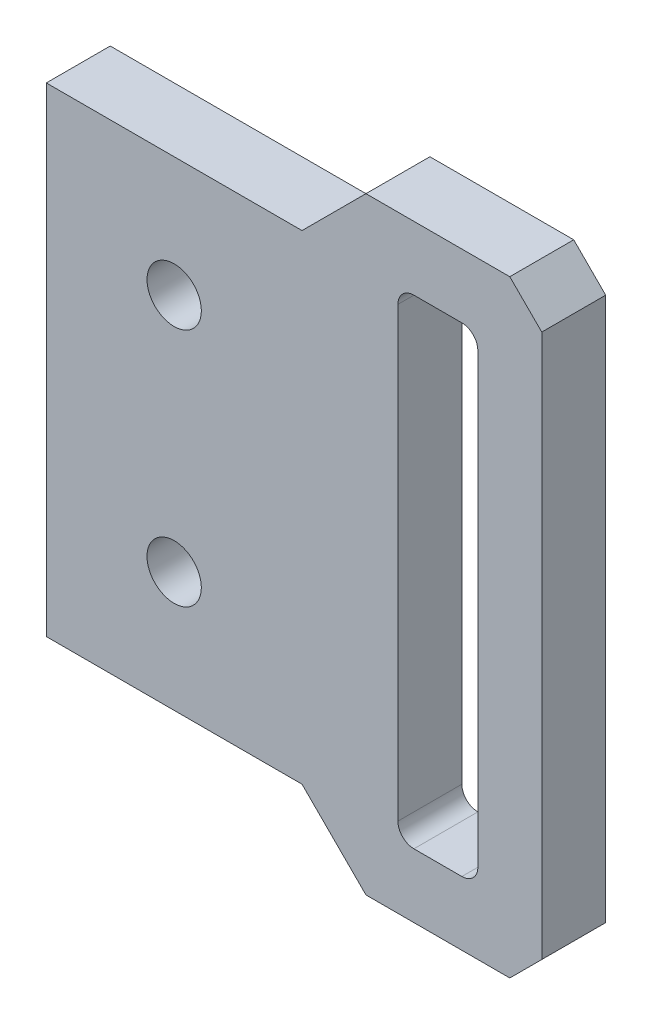
ISO-10303-21;
HEADER;
FILE_DESCRIPTION(('STEP AP214'),'2;1');
FILE_NAME('part.step','',(''),(''),'','','');
FILE_SCHEMA(('AUTOMOTIVE_DESIGN { 1 0 10303 214 1 1 1 1 }'));
ENDSEC;
DATA;
#1=APPLICATION_CONTEXT('core data for automotive mechanical design processes');
#2=APPLICATION_PROTOCOL_DEFINITION('international standard','automotive_design',2000,#1);
#3=PRODUCT_CONTEXT('',#1,'mechanical');
#4=PRODUCT('Part','Part','',(#3));
#5=PRODUCT_RELATED_PRODUCT_CATEGORY('part','',(#4));
#6=PRODUCT_DEFINITION_FORMATION('','',#4);
#7=PRODUCT_DEFINITION_CONTEXT('part definition',#1,'design');
#8=PRODUCT_DEFINITION('design','',#6,#7);
#9=PRODUCT_DEFINITION_SHAPE('','',#8);
#10=(LENGTH_UNIT() NAMED_UNIT(*) SI_UNIT(.MILLI.,.METRE.));
#11=(NAMED_UNIT(*) PLANE_ANGLE_UNIT() SI_UNIT($,.RADIAN.));
#12=(NAMED_UNIT(*) SI_UNIT($,.STERADIAN.) SOLID_ANGLE_UNIT());
#13=UNCERTAINTY_MEASURE_WITH_UNIT(LENGTH_MEASURE(1.E-05),#10,'distance_accuracy_value','');
#14=(GEOMETRIC_REPRESENTATION_CONTEXT(3) GLOBAL_UNCERTAINTY_ASSIGNED_CONTEXT((#13)) GLOBAL_UNIT_ASSIGNED_CONTEXT((#10,
#11,#12)) REPRESENTATION_CONTEXT('',''));
#15=CARTESIAN_POINT('',(0.,0.,0.));
#16=DIRECTION('',(0.,0.,1.));
#17=DIRECTION('',(1.,0.,0.));
#18=AXIS2_PLACEMENT_3D('',#15,#16,#17);
#19=CARTESIAN_POINT('',(0.,0.,4.));
#20=DIRECTION('',(0.,0.,1.));
#21=DIRECTION('',(1.,0.,0.));
#22=AXIS2_PLACEMENT_3D('',#19,#20,#21);
#23=PLANE('',#22);
#24=DIRECTION('',(-1.,0.,0.));
#25=VECTOR('',#24,1.);
#26=CARTESIAN_POINT('',(6.5,19.,4.));
#27=LINE('',#26,#25);
#28=CARTESIAN_POINT('',(4.5,19.,4.));
#29=VERTEX_POINT('',#28);
#30=CARTESIAN_POINT('',(-4.5,19.,4.));
#31=VERTEX_POINT('',#30);
#32=EDGE_CURVE('E168',#29,#31,#27,.T.);
#33=ORIENTED_EDGE('',*,*,#32,.T.);
#34=DIRECTION('',(0.707106781186549,0.707106781186546,0.));
#35=VECTOR('',#34,1.);
#36=CARTESIAN_POINT('',(-11.75,11.75,4.));
#37=LINE('',#36,#35);
#38=CARTESIAN_POINT('',(-8.5,15.,4.));
#39=VERTEX_POINT('',#38);
#40=EDGE_CURVE('E161',#31,#39,#37,.F.);
#41=ORIENTED_EDGE('',*,*,#40,.T.);
#42=DIRECTION('',(-1.,0.,0.));
#43=VECTOR('',#42,1.);
#44=CARTESIAN_POINT('',(-8.5,15.,4.));
#45=LINE('',#44,#43);
#46=CARTESIAN_POINT('',(-24.5,15.,4.));
#47=VERTEX_POINT('',#46);
#48=EDGE_CURVE('E165',#39,#47,#45,.T.);
#49=ORIENTED_EDGE('',*,*,#48,.T.);
#50=DIRECTION('',(0.,-1.,0.));
#51=VECTOR('',#50,1.);
#52=CARTESIAN_POINT('',(-24.5,15.,4.));
#53=LINE('',#52,#51);
#54=CARTESIAN_POINT('',(-24.5,-15.,4.));
#55=VERTEX_POINT('',#54);
#56=EDGE_CURVE('E185',#47,#55,#53,.T.);
#57=ORIENTED_EDGE('',*,*,#56,.T.);
#58=DIRECTION('',(1.,0.,0.));
#59=VECTOR('',#58,1.);
#60=CARTESIAN_POINT('',(-24.5,-15.,4.));
#61=LINE('',#60,#59);
#62=CARTESIAN_POINT('',(-8.5,-15.,4.));
#63=VERTEX_POINT('',#62);
#64=EDGE_CURVE('E188',#55,#63,#61,.T.);
#65=ORIENTED_EDGE('',*,*,#64,.T.);
#66=DIRECTION('',(-0.707106781186546,0.707106781186549,0.));
#67=VECTOR('',#66,1.);
#68=CARTESIAN_POINT('',(-11.75,-11.75,4.));
#69=LINE('',#68,#67);
#70=CARTESIAN_POINT('',(-4.5,-19.,4.));
#71=VERTEX_POINT('',#70);
#72=EDGE_CURVE('E269',#63,#71,#69,.F.);
#73=ORIENTED_EDGE('',*,*,#72,.T.);
#74=DIRECTION('',(1.,0.,0.));
#75=VECTOR('',#74,1.);
#76=CARTESIAN_POINT('',(6.5,-19.,4.));
#77=LINE('',#76,#75);
#78=CARTESIAN_POINT('',(4.5,-19.,4.));
#79=VERTEX_POINT('',#78);
#80=EDGE_CURVE('E240',#71,#79,#77,.T.);
#81=ORIENTED_EDGE('',*,*,#80,.T.);
#82=DIRECTION('',(-0.707106781186549,-0.707106781186546,0.));
#83=VECTOR('',#82,1.);
#84=CARTESIAN_POINT('',(11.75,-11.75,4.));
#85=LINE('',#84,#83);
#86=CARTESIAN_POINT('',(6.5,-17.,4.));
#87=VERTEX_POINT('',#86);
#88=EDGE_CURVE('E172',#79,#87,#85,.F.);
#89=ORIENTED_EDGE('',*,*,#88,.T.);
#90=DIRECTION('',(0.,1.,0.));
#91=VECTOR('',#90,1.);
#92=CARTESIAN_POINT('',(6.5,-19.,4.));
#93=LINE('',#92,#91);
#94=CARTESIAN_POINT('',(6.5,17.,4.));
#95=VERTEX_POINT('',#94);
#96=EDGE_CURVE('E243',#87,#95,#93,.T.);
#97=ORIENTED_EDGE('',*,*,#96,.T.);
#98=DIRECTION('',(0.707106781186546,-0.707106781186549,0.));
#99=VECTOR('',#98,1.);
#100=CARTESIAN_POINT('',(11.75,11.75,4.));
#101=LINE('',#100,#99);
#102=EDGE_CURVE('E267',#95,#29,#101,.F.);
#103=ORIENTED_EDGE('',*,*,#102,.T.);
#104=EDGE_LOOP('',(#33,#41,#49,#57,#65,#73,#81,#89,#97,#103));
#105=FACE_BOUND('',#104,.T.);
#106=DIRECTION('',(0.,1.,0.));
#107=VECTOR('',#106,1.);
#108=CARTESIAN_POINT('',(2.5,-15.,4.));
#109=LINE('',#108,#107);
#110=CARTESIAN_POINT('',(2.5,-14.,4.));
#111=VERTEX_POINT('',#110);
#112=CARTESIAN_POINT('',(2.5,14.,4.));
#113=VERTEX_POINT('',#112);
#114=EDGE_CURVE('E220',#111,#113,#109,.T.);
#115=ORIENTED_EDGE('',*,*,#114,.F.);
#116=CARTESIAN_POINT('',(1.5,-14.,4.));
#117=DIRECTION('',(0.,0.,1.));
#118=DIRECTION('',(1.,0.,0.));
#119=AXIS2_PLACEMENT_3D('',#116,#117,#118);
#120=CIRCLE('',#119,1.);
#121=CARTESIAN_POINT('',(1.5,-15.,4.));
#122=VERTEX_POINT('',#121);
#123=EDGE_CURVE('E302',#111,#122,#120,.F.);
#124=ORIENTED_EDGE('',*,*,#123,.T.);
#125=DIRECTION('',(1.,0.,0.));
#126=VECTOR('',#125,1.);
#127=CARTESIAN_POINT('',(2.5,-15.,4.));
#128=LINE('',#127,#126);
#129=CARTESIAN_POINT('',(-1.5,-15.,4.));
#130=VERTEX_POINT('',#129);
#131=EDGE_CURVE('E217',#130,#122,#128,.T.);
#132=ORIENTED_EDGE('',*,*,#131,.F.);
#133=CARTESIAN_POINT('',(-1.5,-14.,4.));
#134=DIRECTION('',(0.,0.,1.));
#135=DIRECTION('',(1.,0.,0.));
#136=AXIS2_PLACEMENT_3D('',#133,#134,#135);
#137=CIRCLE('',#136,1.);
#138=CARTESIAN_POINT('',(-2.5,-14.,4.));
#139=VERTEX_POINT('',#138);
#140=EDGE_CURVE('E306',#130,#139,#137,.F.);
#141=ORIENTED_EDGE('',*,*,#140,.T.);
#142=DIRECTION('',(0.,-1.,0.));
#143=VECTOR('',#142,1.);
#144=CARTESIAN_POINT('',(-2.5,-15.,4.));
#145=LINE('',#144,#143);
#146=CARTESIAN_POINT('',(-2.5,14.,4.));
#147=VERTEX_POINT('',#146);
#148=EDGE_CURVE('E226',#147,#139,#145,.T.);
#149=ORIENTED_EDGE('',*,*,#148,.F.);
#150=CARTESIAN_POINT('',(-1.5,14.,4.));
#151=DIRECTION('',(0.,0.,1.));
#152=DIRECTION('',(1.,0.,0.));
#153=AXIS2_PLACEMENT_3D('',#150,#151,#152);
#154=CIRCLE('',#153,1.);
#155=CARTESIAN_POINT('',(-1.5,15.,4.));
#156=VERTEX_POINT('',#155);
#157=EDGE_CURVE('E11',#147,#156,#154,.F.);
#158=ORIENTED_EDGE('',*,*,#157,.T.);
#159=DIRECTION('',(-1.,0.,0.));
#160=VECTOR('',#159,1.);
#161=CARTESIAN_POINT('',(2.5,15.,4.));
#162=LINE('',#161,#160);
#163=CARTESIAN_POINT('',(1.5,15.,4.));
#164=VERTEX_POINT('',#163);
#165=EDGE_CURVE('E224',#164,#156,#162,.T.);
#166=ORIENTED_EDGE('',*,*,#165,.F.);
#167=CARTESIAN_POINT('',(1.5,14.,4.));
#168=DIRECTION('',(0.,0.,1.));
#169=DIRECTION('',(1.,0.,0.));
#170=AXIS2_PLACEMENT_3D('',#167,#168,#169);
#171=CIRCLE('',#170,1.);
#172=EDGE_CURVE('E310',#164,#113,#171,.F.);
#173=ORIENTED_EDGE('',*,*,#172,.T.);
#174=EDGE_LOOP('',(#115,#124,#132,#141,#149,#158,#166,#173));
#175=FACE_BOUND('',#174,.T.);
#176=CARTESIAN_POINT('',(-16.5,7.5,4.));
#177=DIRECTION('',(0.,0.,1.));
#178=DIRECTION('',(1.,0.,0.));
#179=AXIS2_PLACEMENT_3D('',#176,#177,#178);
#180=CIRCLE('',#179,1.7);
#181=CARTESIAN_POINT('',(-14.8,7.5,4.));
#182=VERTEX_POINT('',#181);
#183=EDGE_CURVE('E186',#182,#182,#180,.T.);
#184=ORIENTED_EDGE('',*,*,#183,.F.);
#185=EDGE_LOOP('',(#184));
#186=FACE_BOUND('',#185,.T.);
#187=CARTESIAN_POINT('',(-16.5,-7.5,4.));
#188=DIRECTION('',(0.,0.,1.));
#189=DIRECTION('',(1.,0.,0.));
#190=AXIS2_PLACEMENT_3D('',#187,#188,#189);
#191=CIRCLE('',#190,1.7);
#192=CARTESIAN_POINT('',(-14.8,-7.5,4.));
#193=VERTEX_POINT('',#192);
#194=EDGE_CURVE('E191',#193,#193,#191,.T.);
#195=ORIENTED_EDGE('',*,*,#194,.F.);
#196=EDGE_LOOP('',(#195));
#197=FACE_BOUND('',#196,.T.);
#198=ADVANCED_FACE('F35',(#105,#175,#186,#197),#23,.T.);
#199=CARTESIAN_POINT('',(0.,0.,0.));
#200=DIRECTION('',(0.,0.,1.));
#201=DIRECTION('',(1.,0.,0.));
#202=AXIS2_PLACEMENT_3D('',#199,#200,#201);
#203=PLANE('',#202);
#204=DIRECTION('',(0.707106781186546,-0.707106781186549,0.));
#205=VECTOR('',#204,1.);
#206=CARTESIAN_POINT('',(-4.5,-19.,0.));
#207=LINE('',#206,#205);
#208=CARTESIAN_POINT('',(-4.5,-19.,0.));
#209=VERTEX_POINT('',#208);
#210=CARTESIAN_POINT('',(-8.5,-15.,0.));
#211=VERTEX_POINT('',#210);
#212=EDGE_CURVE('E257',#209,#211,#207,.F.);
#213=ORIENTED_EDGE('',*,*,#212,.T.);
#214=DIRECTION('',(1.,0.,0.));
#215=VECTOR('',#214,1.);
#216=CARTESIAN_POINT('',(-24.5,-15.,0.));
#217=LINE('',#216,#215);
#218=CARTESIAN_POINT('',(-24.5,-15.,0.));
#219=VERTEX_POINT('',#218);
#220=EDGE_CURVE('E182',#219,#211,#217,.T.);
#221=ORIENTED_EDGE('',*,*,#220,.F.);
#222=DIRECTION('',(0.,-1.,0.));
#223=VECTOR('',#222,1.);
#224=CARTESIAN_POINT('',(-24.5,15.,0.));
#225=LINE('',#224,#223);
#226=CARTESIAN_POINT('',(-24.5,15.,0.));
#227=VERTEX_POINT('',#226);
#228=EDGE_CURVE('E205',#227,#219,#225,.T.);
#229=ORIENTED_EDGE('',*,*,#228,.F.);
#230=DIRECTION('',(-1.,0.,0.));
#231=VECTOR('',#230,1.);
#232=CARTESIAN_POINT('',(-8.5,15.,0.));
#233=LINE('',#232,#231);
#234=CARTESIAN_POINT('',(-8.5,15.,0.));
#235=VERTEX_POINT('',#234);
#236=EDGE_CURVE('E203',#235,#227,#233,.T.);
#237=ORIENTED_EDGE('',*,*,#236,.F.);
#238=DIRECTION('',(-0.707106781186549,-0.707106781186546,0.));
#239=VECTOR('',#238,1.);
#240=CARTESIAN_POINT('',(-6.5,17.,0.));
#241=LINE('',#240,#239);
#242=CARTESIAN_POINT('',(-4.5,19.,0.));
#243=VERTEX_POINT('',#242);
#244=EDGE_CURVE('E177',#235,#243,#241,.F.);
#245=ORIENTED_EDGE('',*,*,#244,.T.);
#246=DIRECTION('',(-1.,0.,0.));
#247=VECTOR('',#246,1.);
#248=CARTESIAN_POINT('',(6.5,19.,0.));
#249=LINE('',#248,#247);
#250=CARTESIAN_POINT('',(4.5,19.,0.));
#251=VERTEX_POINT('',#250);
#252=EDGE_CURVE('E244',#251,#243,#249,.T.);
#253=ORIENTED_EDGE('',*,*,#252,.F.);
#254=DIRECTION('',(-0.707106781186546,0.707106781186549,0.));
#255=VECTOR('',#254,1.);
#256=CARTESIAN_POINT('',(4.5,19.,0.));
#257=LINE('',#256,#255);
#258=CARTESIAN_POINT('',(6.5,17.,0.));
#259=VERTEX_POINT('',#258);
#260=EDGE_CURVE('E248',#251,#259,#257,.F.);
#261=ORIENTED_EDGE('',*,*,#260,.T.);
#262=DIRECTION('',(0.,1.,0.));
#263=VECTOR('',#262,1.);
#264=CARTESIAN_POINT('',(6.5,-19.,0.));
#265=LINE('',#264,#263);
#266=CARTESIAN_POINT('',(6.5,-17.,0.));
#267=VERTEX_POINT('',#266);
#268=EDGE_CURVE('E251',#267,#259,#265,.T.);
#269=ORIENTED_EDGE('',*,*,#268,.F.);
#270=DIRECTION('',(0.707106781186549,0.707106781186546,0.));
#271=VECTOR('',#270,1.);
#272=CARTESIAN_POINT('',(6.5,-17.,0.));
#273=LINE('',#272,#271);
#274=CARTESIAN_POINT('',(4.5,-19.,0.));
#275=VERTEX_POINT('',#274);
#276=EDGE_CURVE('E259',#267,#275,#273,.F.);
#277=ORIENTED_EDGE('',*,*,#276,.T.);
#278=DIRECTION('',(1.,0.,0.));
#279=VECTOR('',#278,1.);
#280=CARTESIAN_POINT('',(6.5,-19.,0.));
#281=LINE('',#280,#279);
#282=EDGE_CURVE('E229',#209,#275,#281,.T.);
#283=ORIENTED_EDGE('',*,*,#282,.F.);
#284=EDGE_LOOP('',(#213,#221,#229,#237,#245,#253,#261,#269,#277,#283));
#285=FACE_BOUND('',#284,.T.);
#286=DIRECTION('',(0.,-1.,0.));
#287=VECTOR('',#286,1.);
#288=CARTESIAN_POINT('',(-2.5,-15.,0.));
#289=LINE('',#288,#287);
#290=CARTESIAN_POINT('',(-2.5,14.,0.));
#291=VERTEX_POINT('',#290);
#292=CARTESIAN_POINT('',(-2.5,-14.,0.));
#293=VERTEX_POINT('',#292);
#294=EDGE_CURVE('E221',#291,#293,#289,.T.);
#295=ORIENTED_EDGE('',*,*,#294,.T.);
#296=CARTESIAN_POINT('',(-1.5,-14.,0.));
#297=DIRECTION('',(0.,0.,1.));
#298=DIRECTION('',(1.,0.,0.));
#299=AXIS2_PLACEMENT_3D('',#296,#297,#298);
#300=CIRCLE('',#299,1.);
#301=CARTESIAN_POINT('',(-1.5,-15.,0.));
#302=VERTEX_POINT('',#301);
#303=EDGE_CURVE('E304',#293,#302,#300,.T.);
#304=ORIENTED_EDGE('',*,*,#303,.T.);
#305=DIRECTION('',(1.,0.,0.));
#306=VECTOR('',#305,1.);
#307=CARTESIAN_POINT('',(2.5,-15.,0.));
#308=LINE('',#307,#306);
#309=CARTESIAN_POINT('',(1.5,-15.,0.));
#310=VERTEX_POINT('',#309);
#311=EDGE_CURVE('E213',#302,#310,#308,.T.);
#312=ORIENTED_EDGE('',*,*,#311,.T.);
#313=CARTESIAN_POINT('',(1.5,-14.,0.));
#314=DIRECTION('',(0.,0.,1.));
#315=DIRECTION('',(1.,0.,0.));
#316=AXIS2_PLACEMENT_3D('',#313,#314,#315);
#317=CIRCLE('',#316,1.);
#318=CARTESIAN_POINT('',(2.5,-14.,0.));
#319=VERTEX_POINT('',#318);
#320=EDGE_CURVE('E300',#310,#319,#317,.T.);
#321=ORIENTED_EDGE('',*,*,#320,.T.);
#322=DIRECTION('',(0.,1.,0.));
#323=VECTOR('',#322,1.);
#324=CARTESIAN_POINT('',(2.5,-15.,0.));
#325=LINE('',#324,#323);
#326=CARTESIAN_POINT('',(2.5,14.,0.));
#327=VERTEX_POINT('',#326);
#328=EDGE_CURVE('E232',#319,#327,#325,.T.);
#329=ORIENTED_EDGE('',*,*,#328,.T.);
#330=CARTESIAN_POINT('',(1.5,14.,0.));
#331=DIRECTION('',(0.,0.,1.));
#332=DIRECTION('',(1.,0.,0.));
#333=AXIS2_PLACEMENT_3D('',#330,#331,#332);
#334=CIRCLE('',#333,1.);
#335=CARTESIAN_POINT('',(1.5,15.,0.));
#336=VERTEX_POINT('',#335);
#337=EDGE_CURVE('E308',#327,#336,#334,.T.);
#338=ORIENTED_EDGE('',*,*,#337,.T.);
#339=DIRECTION('',(-1.,0.,0.));
#340=VECTOR('',#339,1.);
#341=CARTESIAN_POINT('',(2.5,15.,0.));
#342=LINE('',#341,#340);
#343=CARTESIAN_POINT('',(-1.5,15.,0.));
#344=VERTEX_POINT('',#343);
#345=EDGE_CURVE('E235',#336,#344,#342,.T.);
#346=ORIENTED_EDGE('',*,*,#345,.T.);
#347=CARTESIAN_POINT('',(-1.5,14.,0.));
#348=DIRECTION('',(0.,0.,1.));
#349=DIRECTION('',(1.,0.,0.));
#350=AXIS2_PLACEMENT_3D('',#347,#348,#349);
#351=CIRCLE('',#350,1.);
#352=EDGE_CURVE('E43',#344,#291,#351,.T.);
#353=ORIENTED_EDGE('',*,*,#352,.T.);
#354=EDGE_LOOP('',(#295,#304,#312,#321,#329,#338,#346,#353));
#355=FACE_BOUND('',#354,.T.);
#356=CARTESIAN_POINT('',(-16.5,-7.5,0.));
#357=DIRECTION('',(0.,0.,1.));
#358=DIRECTION('',(1.,0.,0.));
#359=AXIS2_PLACEMENT_3D('',#356,#357,#358);
#360=CIRCLE('',#359,1.7);
#361=CARTESIAN_POINT('',(-14.8,-7.5,0.));
#362=VERTEX_POINT('',#361);
#363=EDGE_CURVE('E197',#362,#362,#360,.T.);
#364=ORIENTED_EDGE('',*,*,#363,.T.);
#365=EDGE_LOOP('',(#364));
#366=FACE_BOUND('',#365,.T.);
#367=CARTESIAN_POINT('',(-16.5,7.5,0.));
#368=DIRECTION('',(0.,0.,1.));
#369=DIRECTION('',(1.,0.,0.));
#370=AXIS2_PLACEMENT_3D('',#367,#368,#369);
#371=CIRCLE('',#370,1.7);
#372=CARTESIAN_POINT('',(-14.8,7.5,0.));
#373=VERTEX_POINT('',#372);
#374=EDGE_CURVE('E200',#373,#373,#371,.T.);
#375=ORIENTED_EDGE('',*,*,#374,.T.);
#376=EDGE_LOOP('',(#375));
#377=FACE_BOUND('',#376,.T.);
#378=ADVANCED_FACE('F313',(#285,#355,#366,#377),#203,.F.);
#379=CARTESIAN_POINT('',(6.5,-19.,4.));
#380=DIRECTION('',(0.,1.,0.));
#381=DIRECTION('',(0.,0.,1.));
#382=AXIS2_PLACEMENT_3D('',#379,#380,#381);
#383=PLANE('',#382);
#384=ORIENTED_EDGE('',*,*,#282,.T.);
#385=DIRECTION('',(0.,0.,1.));
#386=VECTOR('',#385,1.);
#387=CARTESIAN_POINT('',(4.5,-19.,4.));
#388=LINE('',#387,#386);
#389=EDGE_CURVE('E279',#275,#79,#388,.T.);
#390=ORIENTED_EDGE('',*,*,#389,.T.);
#391=ORIENTED_EDGE('',*,*,#80,.F.);
#392=DIRECTION('',(0.,0.,-1.));
#393=VECTOR('',#392,1.);
#394=CARTESIAN_POINT('',(-4.5,-19.,4.));
#395=LINE('',#394,#393);
#396=EDGE_CURVE('E276',#71,#209,#395,.T.);
#397=ORIENTED_EDGE('',*,*,#396,.T.);
#398=EDGE_LOOP('',(#384,#390,#391,#397));
#399=FACE_BOUND('',#398,.T.);
#400=ADVANCED_FACE('F357',(#399),#383,.F.);
#401=CARTESIAN_POINT('',(6.5,-19.,4.));
#402=DIRECTION('',(-1.,0.,0.));
#403=DIRECTION('',(0.,0.,1.));
#404=AXIS2_PLACEMENT_3D('',#401,#402,#403);
#405=PLANE('',#404);
#406=ORIENTED_EDGE('',*,*,#96,.F.);
#407=DIRECTION('',(0.,0.,-1.));
#408=VECTOR('',#407,1.);
#409=CARTESIAN_POINT('',(6.5,-17.,4.));
#410=LINE('',#409,#408);
#411=EDGE_CURVE('E273',#87,#267,#410,.T.);
#412=ORIENTED_EDGE('',*,*,#411,.T.);
#413=ORIENTED_EDGE('',*,*,#268,.T.);
#414=DIRECTION('',(0.,0.,1.));
#415=VECTOR('',#414,1.);
#416=CARTESIAN_POINT('',(6.5,17.,4.));
#417=LINE('',#416,#415);
#418=EDGE_CURVE('E171',#259,#95,#417,.T.);
#419=ORIENTED_EDGE('',*,*,#418,.T.);
#420=EDGE_LOOP('',(#406,#412,#413,#419));
#421=FACE_BOUND('',#420,.T.);
#422=ADVANCED_FACE('F366',(#421),#405,.F.);
#423=CARTESIAN_POINT('',(6.5,19.,4.));
#424=DIRECTION('',(0.,-1.,0.));
#425=DIRECTION('',(0.,0.,-1.));
#426=AXIS2_PLACEMENT_3D('',#423,#424,#425);
#427=PLANE('',#426);
#428=ORIENTED_EDGE('',*,*,#252,.T.);
#429=DIRECTION('',(0.,0.,1.));
#430=VECTOR('',#429,1.);
#431=CARTESIAN_POINT('',(-4.5,19.,4.));
#432=LINE('',#431,#430);
#433=EDGE_CURVE('E265',#243,#31,#432,.T.);
#434=ORIENTED_EDGE('',*,*,#433,.T.);
#435=ORIENTED_EDGE('',*,*,#32,.F.);
#436=DIRECTION('',(0.,0.,-1.));
#437=VECTOR('',#436,1.);
#438=CARTESIAN_POINT('',(4.5,19.,4.));
#439=LINE('',#438,#437);
#440=EDGE_CURVE('E262',#29,#251,#439,.T.);
#441=ORIENTED_EDGE('',*,*,#440,.T.);
#442=EDGE_LOOP('',(#428,#434,#435,#441));
#443=FACE_BOUND('',#442,.T.);
#444=ADVANCED_FACE('F363',(#443),#427,.F.);
#445=CARTESIAN_POINT('',(2.5,-15.,4.));
#446=DIRECTION('',(0.,1.,0.));
#447=DIRECTION('',(0.,0.,1.));
#448=AXIS2_PLACEMENT_3D('',#445,#446,#447);
#449=PLANE('',#448);
#450=ORIENTED_EDGE('',*,*,#131,.T.);
#451=DIRECTION('',(0.,0.,-1.));
#452=VECTOR('',#451,1.);
#453=CARTESIAN_POINT('',(1.5,-15.,0.));
#454=LINE('',#453,#452);
#455=EDGE_CURVE('E283',#122,#310,#454,.T.);
#456=ORIENTED_EDGE('',*,*,#455,.T.);
#457=ORIENTED_EDGE('',*,*,#311,.F.);
#458=DIRECTION('',(0.,0.,-1.));
#459=VECTOR('',#458,1.);
#460=CARTESIAN_POINT('',(-1.5,-15.,4.));
#461=LINE('',#460,#459);
#462=EDGE_CURVE('E281',#302,#130,#461,.F.);
#463=ORIENTED_EDGE('',*,*,#462,.T.);
#464=EDGE_LOOP('',(#450,#456,#457,#463));
#465=FACE_BOUND('',#464,.T.);
#466=ADVANCED_FACE('F338',(#465),#449,.T.);
#467=CARTESIAN_POINT('',(2.5,-15.,4.));
#468=DIRECTION('',(-1.,0.,0.));
#469=DIRECTION('',(0.,0.,1.));
#470=AXIS2_PLACEMENT_3D('',#467,#468,#469);
#471=PLANE('',#470);
#472=ORIENTED_EDGE('',*,*,#328,.F.);
#473=DIRECTION('',(0.,0.,-1.));
#474=VECTOR('',#473,1.);
#475=CARTESIAN_POINT('',(2.5,-14.,4.));
#476=LINE('',#475,#474);
#477=EDGE_CURVE('E289',#319,#111,#476,.F.);
#478=ORIENTED_EDGE('',*,*,#477,.T.);
#479=ORIENTED_EDGE('',*,*,#114,.T.);
#480=DIRECTION('',(0.,0.,-1.));
#481=VECTOR('',#480,1.);
#482=CARTESIAN_POINT('',(2.5,14.,0.));
#483=LINE('',#482,#481);
#484=EDGE_CURVE('E286',#113,#327,#483,.T.);
#485=ORIENTED_EDGE('',*,*,#484,.T.);
#486=EDGE_LOOP('',(#472,#478,#479,#485));
#487=FACE_BOUND('',#486,.T.);
#488=ADVANCED_FACE('F330',(#487),#471,.T.);
#489=CARTESIAN_POINT('',(2.5,15.,4.));
#490=DIRECTION('',(0.,-1.,0.));
#491=DIRECTION('',(0.,0.,-1.));
#492=AXIS2_PLACEMENT_3D('',#489,#490,#491);
#493=PLANE('',#492);
#494=ORIENTED_EDGE('',*,*,#345,.F.);
#495=DIRECTION('',(0.,0.,-1.));
#496=VECTOR('',#495,1.);
#497=CARTESIAN_POINT('',(1.5,15.,4.));
#498=LINE('',#497,#496);
#499=EDGE_CURVE('E55',#336,#164,#498,.F.);
#500=ORIENTED_EDGE('',*,*,#499,.T.);
#501=ORIENTED_EDGE('',*,*,#165,.T.);
#502=DIRECTION('',(0.,0.,-1.));
#503=VECTOR('',#502,1.);
#504=CARTESIAN_POINT('',(-1.5,15.,0.));
#505=LINE('',#504,#503);
#506=EDGE_CURVE('E296',#156,#344,#505,.T.);
#507=ORIENTED_EDGE('',*,*,#506,.T.);
#508=EDGE_LOOP('',(#494,#500,#501,#507));
#509=FACE_BOUND('',#508,.T.);
#510=ADVANCED_FACE('F321',(#509),#493,.T.);
#511=CARTESIAN_POINT('',(-2.5,-15.,4.));
#512=DIRECTION('',(1.,0.,0.));
#513=DIRECTION('',(0.,0.,-1.));
#514=AXIS2_PLACEMENT_3D('',#511,#512,#513);
#515=PLANE('',#514);
#516=ORIENTED_EDGE('',*,*,#148,.T.);
#517=DIRECTION('',(0.,0.,-1.));
#518=VECTOR('',#517,1.);
#519=CARTESIAN_POINT('',(-2.5,-14.,0.));
#520=LINE('',#519,#518);
#521=EDGE_CURVE('E293',#139,#293,#520,.T.);
#522=ORIENTED_EDGE('',*,*,#521,.T.);
#523=ORIENTED_EDGE('',*,*,#294,.F.);
#524=DIRECTION('',(0.,0.,-1.));
#525=VECTOR('',#524,1.);
#526=CARTESIAN_POINT('',(-2.5,14.,4.));
#527=LINE('',#526,#525);
#528=EDGE_CURVE('E291',#291,#147,#527,.F.);
#529=ORIENTED_EDGE('',*,*,#528,.T.);
#530=EDGE_LOOP('',(#516,#522,#523,#529));
#531=FACE_BOUND('',#530,.T.);
#532=ADVANCED_FACE('F319',(#531),#515,.T.);
#533=CARTESIAN_POINT('',(-6.5,17.,4.));
#534=DIRECTION('',(0.707106781186546,-0.707106781186549,0.));
#535=DIRECTION('',(0.,0.,-1.));
#536=AXIS2_PLACEMENT_3D('',#533,#534,#535);
#537=PLANE('',#536);
#538=ORIENTED_EDGE('',*,*,#40,.F.);
#539=ORIENTED_EDGE('',*,*,#433,.F.);
#540=ORIENTED_EDGE('',*,*,#244,.F.);
#541=DIRECTION('',(0.,0.,1.));
#542=VECTOR('',#541,1.);
#543=CARTESIAN_POINT('',(-8.5,15.,0.));
#544=LINE('',#543,#542);
#545=EDGE_CURVE('E175',#235,#39,#544,.T.);
#546=ORIENTED_EDGE('',*,*,#545,.T.);
#547=EDGE_LOOP('',(#538,#539,#540,#546));
#548=FACE_BOUND('',#547,.T.);
#549=ADVANCED_FACE('F176',(#548),#537,.F.);
#550=CARTESIAN_POINT('',(6.5,-17.,4.));
#551=DIRECTION('',(-0.707106781186546,0.707106781186549,0.));
#552=DIRECTION('',(0.,0.,-1.));
#553=AXIS2_PLACEMENT_3D('',#550,#551,#552);
#554=PLANE('',#553);
#555=ORIENTED_EDGE('',*,*,#88,.F.);
#556=ORIENTED_EDGE('',*,*,#389,.F.);
#557=ORIENTED_EDGE('',*,*,#276,.F.);
#558=ORIENTED_EDGE('',*,*,#411,.F.);
#559=EDGE_LOOP('',(#555,#556,#557,#558));
#560=FACE_BOUND('',#559,.T.);
#561=ADVANCED_FACE('F380',(#560),#554,.F.);
#562=CARTESIAN_POINT('',(-4.5,-19.,4.));
#563=DIRECTION('',(0.707106781186549,0.707106781186546,0.));
#564=DIRECTION('',(0.,0.,-1.));
#565=AXIS2_PLACEMENT_3D('',#562,#563,#564);
#566=PLANE('',#565);
#567=ORIENTED_EDGE('',*,*,#72,.F.);
#568=DIRECTION('',(0.,0.,1.));
#569=VECTOR('',#568,1.);
#570=CARTESIAN_POINT('',(-8.5,-15.,0.));
#571=LINE('',#570,#569);
#572=EDGE_CURVE('E210',#211,#63,#571,.T.);
#573=ORIENTED_EDGE('',*,*,#572,.F.);
#574=ORIENTED_EDGE('',*,*,#212,.F.);
#575=ORIENTED_EDGE('',*,*,#396,.F.);
#576=EDGE_LOOP('',(#567,#573,#574,#575));
#577=FACE_BOUND('',#576,.T.);
#578=ADVANCED_FACE('F386',(#577),#566,.F.);
#579=CARTESIAN_POINT('',(4.5,19.,4.));
#580=DIRECTION('',(-0.707106781186549,-0.707106781186546,0.));
#581=DIRECTION('',(0.,0.,-1.));
#582=AXIS2_PLACEMENT_3D('',#579,#580,#581);
#583=PLANE('',#582);
#584=ORIENTED_EDGE('',*,*,#102,.F.);
#585=ORIENTED_EDGE('',*,*,#418,.F.);
#586=ORIENTED_EDGE('',*,*,#260,.F.);
#587=ORIENTED_EDGE('',*,*,#440,.F.);
#588=EDGE_LOOP('',(#584,#585,#586,#587));
#589=FACE_BOUND('',#588,.T.);
#590=ADVANCED_FACE('F393',(#589),#583,.F.);
#591=CARTESIAN_POINT('',(-24.5,-15.,0.));
#592=DIRECTION('',(0.,-1.,0.));
#593=DIRECTION('',(1.,0.,0.));
#594=AXIS2_PLACEMENT_3D('',#591,#592,#593);
#595=PLANE('',#594);
#596=ORIENTED_EDGE('',*,*,#572,.T.);
#597=ORIENTED_EDGE('',*,*,#64,.F.);
#598=DIRECTION('',(0.,0.,1.));
#599=VECTOR('',#598,1.);
#600=CARTESIAN_POINT('',(-24.5,-15.,0.));
#601=LINE('',#600,#599);
#602=EDGE_CURVE('E214',#219,#55,#601,.T.);
#603=ORIENTED_EDGE('',*,*,#602,.F.);
#604=ORIENTED_EDGE('',*,*,#220,.T.);
#605=EDGE_LOOP('',(#596,#597,#603,#604));
#606=FACE_BOUND('',#605,.T.);
#607=ADVANCED_FACE('F398',(#606),#595,.T.);
#608=CARTESIAN_POINT('',(-24.5,15.,0.));
#609=DIRECTION('',(-1.,0.,0.));
#610=DIRECTION('',(0.,-1.,0.));
#611=AXIS2_PLACEMENT_3D('',#608,#609,#610);
#612=PLANE('',#611);
#613=ORIENTED_EDGE('',*,*,#602,.T.);
#614=ORIENTED_EDGE('',*,*,#56,.F.);
#615=DIRECTION('',(0.,0.,1.));
#616=VECTOR('',#615,1.);
#617=CARTESIAN_POINT('',(-24.5,15.,0.));
#618=LINE('',#617,#616);
#619=EDGE_CURVE('E181',#227,#47,#618,.T.);
#620=ORIENTED_EDGE('',*,*,#619,.F.);
#621=ORIENTED_EDGE('',*,*,#228,.T.);
#622=EDGE_LOOP('',(#613,#614,#620,#621));
#623=FACE_BOUND('',#622,.T.);
#624=ADVANCED_FACE('F403',(#623),#612,.T.);
#625=CARTESIAN_POINT('',(-8.5,15.,0.));
#626=DIRECTION('',(0.,1.,0.));
#627=DIRECTION('',(-1.,0.,0.));
#628=AXIS2_PLACEMENT_3D('',#625,#626,#627);
#629=PLANE('',#628);
#630=ORIENTED_EDGE('',*,*,#619,.T.);
#631=ORIENTED_EDGE('',*,*,#48,.F.);
#632=ORIENTED_EDGE('',*,*,#545,.F.);
#633=ORIENTED_EDGE('',*,*,#236,.T.);
#634=EDGE_LOOP('',(#630,#631,#632,#633));
#635=FACE_BOUND('',#634,.T.);
#636=ADVANCED_FACE('F184',(#635),#629,.T.);
#637=CARTESIAN_POINT('',(-16.5,7.5,0.));
#638=DIRECTION('',(0.,0.,1.));
#639=DIRECTION('',(1.,0.,0.));
#640=AXIS2_PLACEMENT_3D('',#637,#638,#639);
#641=CYLINDRICAL_SURFACE('',#640,1.7);
#642=ORIENTED_EDGE('',*,*,#374,.F.);
#643=EDGE_LOOP('',(#642));
#644=FACE_BOUND('',#643,.T.);
#645=ORIENTED_EDGE('',*,*,#183,.T.);
#646=EDGE_LOOP('',(#645));
#647=FACE_BOUND('',#646,.T.);
#648=ADVANCED_FACE('F428',(#644,#647),#641,.F.);
#649=CARTESIAN_POINT('',(-16.5,-7.5,0.));
#650=DIRECTION('',(0.,0.,1.));
#651=DIRECTION('',(1.,0.,0.));
#652=AXIS2_PLACEMENT_3D('',#649,#650,#651);
#653=CYLINDRICAL_SURFACE('',#652,1.7);
#654=ORIENTED_EDGE('',*,*,#363,.F.);
#655=EDGE_LOOP('',(#654));
#656=FACE_BOUND('',#655,.T.);
#657=ORIENTED_EDGE('',*,*,#194,.T.);
#658=EDGE_LOOP('',(#657));
#659=FACE_BOUND('',#658,.T.);
#660=ADVANCED_FACE('F350',(#656,#659),#653,.F.);
#661=CARTESIAN_POINT('',(1.5,-14.,4.));
#662=DIRECTION('',(0.,0.,1.));
#663=DIRECTION('',(1.,0.,0.));
#664=AXIS2_PLACEMENT_3D('',#661,#662,#663);
#665=CYLINDRICAL_SURFACE('',#664,1.);
#666=ORIENTED_EDGE('',*,*,#123,.F.);
#667=ORIENTED_EDGE('',*,*,#477,.F.);
#668=ORIENTED_EDGE('',*,*,#320,.F.);
#669=ORIENTED_EDGE('',*,*,#455,.F.);
#670=EDGE_LOOP('',(#666,#667,#668,#669));
#671=FACE_BOUND('',#670,.T.);
#672=ADVANCED_FACE('F336',(#671),#665,.F.);
#673=CARTESIAN_POINT('',(-1.5,-14.,4.));
#674=DIRECTION('',(0.,0.,1.));
#675=DIRECTION('',(1.,0.,0.));
#676=AXIS2_PLACEMENT_3D('',#673,#674,#675);
#677=CYLINDRICAL_SURFACE('',#676,1.);
#678=ORIENTED_EDGE('',*,*,#140,.F.);
#679=ORIENTED_EDGE('',*,*,#462,.F.);
#680=ORIENTED_EDGE('',*,*,#303,.F.);
#681=ORIENTED_EDGE('',*,*,#521,.F.);
#682=EDGE_LOOP('',(#678,#679,#680,#681));
#683=FACE_BOUND('',#682,.T.);
#684=ADVANCED_FACE('F343',(#683),#677,.F.);
#685=CARTESIAN_POINT('',(1.5,14.,4.));
#686=DIRECTION('',(0.,0.,1.));
#687=DIRECTION('',(1.,0.,0.));
#688=AXIS2_PLACEMENT_3D('',#685,#686,#687);
#689=CYLINDRICAL_SURFACE('',#688,1.);
#690=ORIENTED_EDGE('',*,*,#172,.F.);
#691=ORIENTED_EDGE('',*,*,#499,.F.);
#692=ORIENTED_EDGE('',*,*,#337,.F.);
#693=ORIENTED_EDGE('',*,*,#484,.F.);
#694=EDGE_LOOP('',(#690,#691,#692,#693));
#695=FACE_BOUND('',#694,.T.);
#696=ADVANCED_FACE('F327',(#695),#689,.F.);
#697=CARTESIAN_POINT('',(-1.5,14.,4.));
#698=DIRECTION('',(0.,0.,1.));
#699=DIRECTION('',(1.,0.,0.));
#700=AXIS2_PLACEMENT_3D('',#697,#698,#699);
#701=CYLINDRICAL_SURFACE('',#700,1.);
#702=ORIENTED_EDGE('',*,*,#157,.F.);
#703=ORIENTED_EDGE('',*,*,#528,.F.);
#704=ORIENTED_EDGE('',*,*,#352,.F.);
#705=ORIENTED_EDGE('',*,*,#506,.F.);
#706=EDGE_LOOP('',(#702,#703,#704,#705));
#707=FACE_BOUND('',#706,.T.);
#708=ADVANCED_FACE('F37',(#707),#701,.F.);
#709=CLOSED_SHELL('',(#198,#378,#400,#422,#444,#466,#488,#510,#532,#549,#561,#578,#590,#607,
#624,#636,#648,#660,#672,#684,#696,#708));
#710=MANIFOLD_SOLID_BREP('B2',#709);
#711=ADVANCED_BREP_SHAPE_REPRESENTATION('',(#18,#710),#14);
#712=SHAPE_DEFINITION_REPRESENTATION(#9,#711);
ENDSEC;
END-ISO-10303-21;
